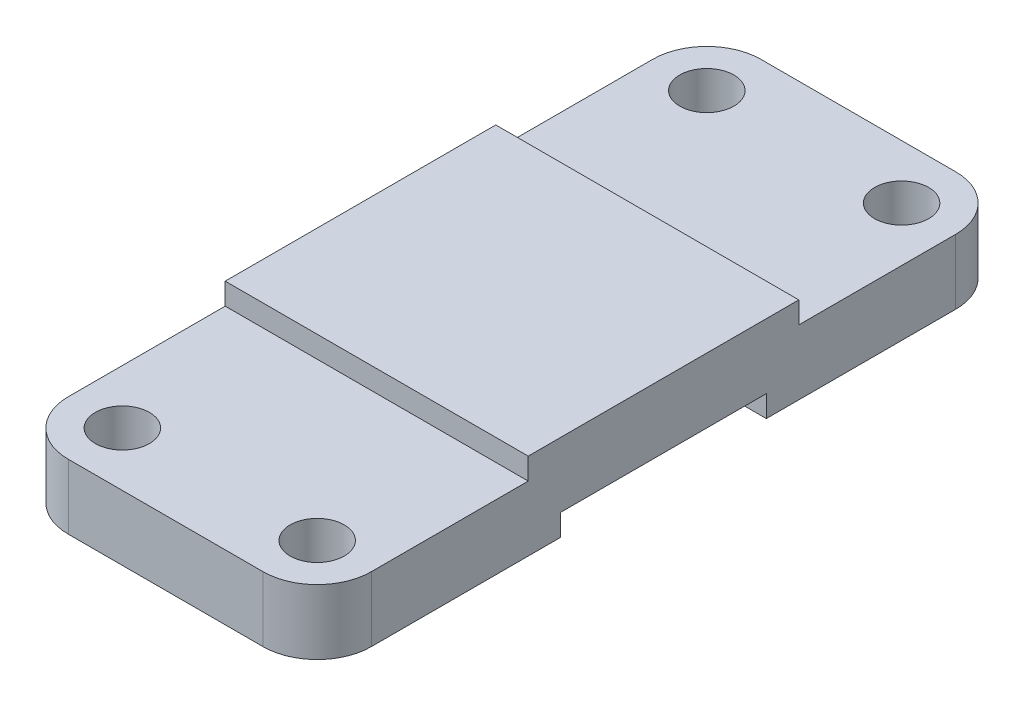
ISO-10303-21;
HEADER;
FILE_DESCRIPTION(('STEP AP214'),'2;1');
FILE_NAME('part.step','',(''),(''),'','','');
FILE_SCHEMA(('AUTOMOTIVE_DESIGN { 1 0 10303 214 1 1 1 1 }'));
ENDSEC;
DATA;
#1=APPLICATION_CONTEXT('core data for automotive mechanical design processes');
#2=APPLICATION_PROTOCOL_DEFINITION('international standard','automotive_design',2000,#1);
#3=PRODUCT_CONTEXT('',#1,'mechanical');
#4=PRODUCT('Part','Part','',(#3));
#5=PRODUCT_RELATED_PRODUCT_CATEGORY('part','',(#4));
#6=PRODUCT_DEFINITION_FORMATION('','',#4);
#7=PRODUCT_DEFINITION_CONTEXT('part definition',#1,'design');
#8=PRODUCT_DEFINITION('design','',#6,#7);
#9=PRODUCT_DEFINITION_SHAPE('','',#8);
#10=(LENGTH_UNIT() NAMED_UNIT(*) SI_UNIT(.MILLI.,.METRE.));
#11=(NAMED_UNIT(*) PLANE_ANGLE_UNIT() SI_UNIT($,.RADIAN.));
#12=(NAMED_UNIT(*) SI_UNIT($,.STERADIAN.) SOLID_ANGLE_UNIT());
#13=UNCERTAINTY_MEASURE_WITH_UNIT(LENGTH_MEASURE(1.E-05),#10,'distance_accuracy_value','');
#14=(GEOMETRIC_REPRESENTATION_CONTEXT(3) GLOBAL_UNCERTAINTY_ASSIGNED_CONTEXT((#13)) GLOBAL_UNIT_ASSIGNED_CONTEXT((#10,
#11,#12)) REPRESENTATION_CONTEXT('',''));
#15=CARTESIAN_POINT('',(0.,0.,0.));
#16=DIRECTION('',(0.,0.,1.));
#17=DIRECTION('',(1.,0.,0.));
#18=AXIS2_PLACEMENT_3D('',#15,#16,#17);
#19=CARTESIAN_POINT('',(-56.,0.,0.));
#20=DIRECTION('',(0.,0.,1.));
#21=DIRECTION('',(1.,0.,0.));
#22=AXIS2_PLACEMENT_3D('',#19,#20,#21);
#23=PLANE('',#22);
#24=DIRECTION('',(1.,0.,0.));
#25=VECTOR('',#24,1.);
#26=CARTESIAN_POINT('',(-56.,12.,0.));
#27=LINE('',#26,#25);
#28=CARTESIAN_POINT('',(-46.,12.,0.));
#29=VERTEX_POINT('',#28);
#30=CARTESIAN_POINT('',(-10.,12.,0.));
#31=VERTEX_POINT('',#30);
#32=EDGE_CURVE('E254',#29,#31,#27,.T.);
#33=ORIENTED_EDGE('',*,*,#32,.F.);
#34=DIRECTION('',(0.,-1.,0.));
#35=VECTOR('',#34,1.);
#36=CARTESIAN_POINT('',(-46.,0.,0.));
#37=LINE('',#36,#35);
#38=CARTESIAN_POINT('',(-46.,0.,0.));
#39=VERTEX_POINT('',#38);
#40=EDGE_CURVE('E325',#29,#39,#37,.T.);
#41=ORIENTED_EDGE('',*,*,#40,.T.);
#42=DIRECTION('',(1.,0.,0.));
#43=VECTOR('',#42,1.);
#44=CARTESIAN_POINT('',(-56.,0.,0.));
#45=LINE('',#44,#43);
#46=CARTESIAN_POINT('',(-10.,0.,0.));
#47=VERTEX_POINT('',#46);
#48=EDGE_CURVE('E177',#39,#47,#45,.T.);
#49=ORIENTED_EDGE('',*,*,#48,.T.);
#50=DIRECTION('',(0.,-1.,0.));
#51=VECTOR('',#50,1.);
#52=CARTESIAN_POINT('',(-10.,12.,0.));
#53=LINE('',#52,#51);
#54=EDGE_CURVE('E322',#47,#31,#53,.F.);
#55=ORIENTED_EDGE('',*,*,#54,.T.);
#56=EDGE_LOOP('',(#33,#41,#49,#55));
#57=FACE_BOUND('',#56,.T.);
#58=ADVANCED_FACE('F45',(#57),#23,.T.);
#59=CARTESIAN_POINT('',(-56.,12.,0.));
#60=DIRECTION('',(0.,1.,0.));
#61=DIRECTION('',(0.,0.,1.));
#62=AXIS2_PLACEMENT_3D('',#59,#60,#61);
#63=PLANE('',#62);
#64=CARTESIAN_POINT('',(-46.,12.,-10.));
#65=DIRECTION('',(0.,1.,0.));
#66=DIRECTION('',(0.,0.,1.));
#67=AXIS2_PLACEMENT_3D('',#64,#65,#66);
#68=CIRCLE('',#67,5.);
#69=CARTESIAN_POINT('',(-46.,12.,-5.));
#70=VERTEX_POINT('',#69);
#71=EDGE_CURVE('E468',#70,#70,#68,.T.);
#72=ORIENTED_EDGE('',*,*,#71,.F.);
#73=EDGE_LOOP('',(#72));
#74=FACE_BOUND('',#73,.T.);
#75=CARTESIAN_POINT('',(-10.,12.,-9.99999999999999));
#76=DIRECTION('',(0.,1.,0.));
#77=DIRECTION('',(0.,0.,1.));
#78=AXIS2_PLACEMENT_3D('',#75,#76,#77);
#79=CIRCLE('',#78,5.);
#80=CARTESIAN_POINT('',(-10.,12.,-5.));
#81=VERTEX_POINT('',#80);
#82=EDGE_CURVE('E476',#81,#81,#79,.T.);
#83=ORIENTED_EDGE('',*,*,#82,.F.);
#84=EDGE_LOOP('',(#83));
#85=FACE_BOUND('',#84,.T.);
#86=DIRECTION('',(0.,0.,1.));
#87=VECTOR('',#86,1.);
#88=CARTESIAN_POINT('',(-56.,12.,0.));
#89=LINE('',#88,#87);
#90=CARTESIAN_POINT('',(-56.,12.,-39.));
#91=VERTEX_POINT('',#90);
#92=CARTESIAN_POINT('',(-56.,12.,-10.));
#93=VERTEX_POINT('',#92);
#94=EDGE_CURVE('E214',#91,#93,#89,.T.);
#95=ORIENTED_EDGE('',*,*,#94,.T.);
#96=CARTESIAN_POINT('',(-46.,12.,-10.));
#97=DIRECTION('',(0.,1.,0.));
#98=DIRECTION('',(0.,0.,1.));
#99=AXIS2_PLACEMENT_3D('',#96,#97,#98);
#100=CIRCLE('',#99,10.);
#101=EDGE_CURVE('E11',#93,#29,#100,.T.);
#102=ORIENTED_EDGE('',*,*,#101,.T.);
#103=ORIENTED_EDGE('',*,*,#32,.T.);
#104=CARTESIAN_POINT('',(-10.,12.,-10.));
#105=DIRECTION('',(0.,1.,0.));
#106=DIRECTION('',(0.,0.,1.));
#107=AXIS2_PLACEMENT_3D('',#104,#105,#106);
#108=CIRCLE('',#107,10.);
#109=CARTESIAN_POINT('',(0.,12.,-10.));
#110=VERTEX_POINT('',#109);
#111=EDGE_CURVE('E54',#31,#110,#108,.T.);
#112=ORIENTED_EDGE('',*,*,#111,.T.);
#113=DIRECTION('',(0.,0.,1.));
#114=VECTOR('',#113,1.);
#115=CARTESIAN_POINT('',(0.,12.,0.));
#116=LINE('',#115,#114);
#117=CARTESIAN_POINT('',(0.,12.,-39.));
#118=VERTEX_POINT('',#117);
#119=EDGE_CURVE('E168',#118,#110,#116,.T.);
#120=ORIENTED_EDGE('',*,*,#119,.F.);
#121=DIRECTION('',(1.,0.,0.));
#122=VECTOR('',#121,1.);
#123=CARTESIAN_POINT('',(-56.,12.,-39.));
#124=LINE('',#123,#122);
#125=EDGE_CURVE('E259',#91,#118,#124,.T.);
#126=ORIENTED_EDGE('',*,*,#125,.F.);
#127=EDGE_LOOP('',(#95,#102,#103,#112,#120,#126));
#128=FACE_BOUND('',#127,.T.);
#129=ADVANCED_FACE('F335',(#74,#85,#128),#63,.T.);
#130=CARTESIAN_POINT('',(-56.,12.,-39.));
#131=DIRECTION('',(0.,0.,1.));
#132=DIRECTION('',(1.,0.,0.));
#133=AXIS2_PLACEMENT_3D('',#130,#131,#132);
#134=PLANE('',#133);
#135=DIRECTION('',(0.,-1.,0.));
#136=VECTOR('',#135,1.);
#137=CARTESIAN_POINT('',(0.,12.,-39.));
#138=LINE('',#137,#136);
#139=CARTESIAN_POINT('',(0.,16.,-39.));
#140=VERTEX_POINT('',#139);
#141=EDGE_CURVE('E247',#140,#118,#138,.T.);
#142=ORIENTED_EDGE('',*,*,#141,.F.);
#143=DIRECTION('',(1.,0.,0.));
#144=VECTOR('',#143,1.);
#145=CARTESIAN_POINT('',(-56.,16.,-39.));
#146=LINE('',#145,#144);
#147=CARTESIAN_POINT('',(-56.,16.,-39.));
#148=VERTEX_POINT('',#147);
#149=EDGE_CURVE('E262',#148,#140,#146,.T.);
#150=ORIENTED_EDGE('',*,*,#149,.F.);
#151=DIRECTION('',(0.,-1.,0.));
#152=VECTOR('',#151,1.);
#153=CARTESIAN_POINT('',(-56.,12.,-39.));
#154=LINE('',#153,#152);
#155=EDGE_CURVE('E210',#148,#91,#154,.T.);
#156=ORIENTED_EDGE('',*,*,#155,.T.);
#157=ORIENTED_EDGE('',*,*,#125,.T.);
#158=EDGE_LOOP('',(#142,#150,#156,#157));
#159=FACE_BOUND('',#158,.T.);
#160=ADVANCED_FACE('F398',(#159),#134,.T.);
#161=CARTESIAN_POINT('',(-56.,16.,-39.));
#162=DIRECTION('',(0.,1.,0.));
#163=DIRECTION('',(0.,0.,1.));
#164=AXIS2_PLACEMENT_3D('',#161,#162,#163);
#165=PLANE('',#164);
#166=DIRECTION('',(0.,0.,1.));
#167=VECTOR('',#166,1.);
#168=CARTESIAN_POINT('',(0.,16.,-39.));
#169=LINE('',#168,#167);
#170=CARTESIAN_POINT('',(0.,16.,-89.));
#171=VERTEX_POINT('',#170);
#172=EDGE_CURVE('E243',#171,#140,#169,.T.);
#173=ORIENTED_EDGE('',*,*,#172,.F.);
#174=DIRECTION('',(1.,0.,0.));
#175=VECTOR('',#174,1.);
#176=CARTESIAN_POINT('',(-56.,16.,-89.));
#177=LINE('',#176,#175);
#178=CARTESIAN_POINT('',(-56.,16.,-89.));
#179=VERTEX_POINT('',#178);
#180=EDGE_CURVE('E265',#179,#171,#177,.T.);
#181=ORIENTED_EDGE('',*,*,#180,.F.);
#182=DIRECTION('',(0.,0.,1.));
#183=VECTOR('',#182,1.);
#184=CARTESIAN_POINT('',(-56.,16.,-39.));
#185=LINE('',#184,#183);
#186=EDGE_CURVE('E206',#179,#148,#185,.T.);
#187=ORIENTED_EDGE('',*,*,#186,.T.);
#188=ORIENTED_EDGE('',*,*,#149,.T.);
#189=EDGE_LOOP('',(#173,#181,#187,#188));
#190=FACE_BOUND('',#189,.T.);
#191=ADVANCED_FACE('F353',(#190),#165,.T.);
#192=CARTESIAN_POINT('',(-56.,12.,-89.));
#193=DIRECTION('',(0.,0.,-1.));
#194=DIRECTION('',(-1.,0.,0.));
#195=AXIS2_PLACEMENT_3D('',#192,#193,#194);
#196=PLANE('',#195);
#197=DIRECTION('',(0.,1.,0.));
#198=VECTOR('',#197,1.);
#199=CARTESIAN_POINT('',(0.,12.,-89.));
#200=LINE('',#199,#198);
#201=CARTESIAN_POINT('',(0.,12.,-89.));
#202=VERTEX_POINT('',#201);
#203=EDGE_CURVE('E239',#202,#171,#200,.T.);
#204=ORIENTED_EDGE('',*,*,#203,.F.);
#205=DIRECTION('',(1.,0.,0.));
#206=VECTOR('',#205,1.);
#207=CARTESIAN_POINT('',(-56.,12.,-89.));
#208=LINE('',#207,#206);
#209=CARTESIAN_POINT('',(-56.,12.,-89.));
#210=VERTEX_POINT('',#209);
#211=EDGE_CURVE('E268',#210,#202,#208,.T.);
#212=ORIENTED_EDGE('',*,*,#211,.F.);
#213=DIRECTION('',(0.,1.,0.));
#214=VECTOR('',#213,1.);
#215=CARTESIAN_POINT('',(-56.,12.,-89.));
#216=LINE('',#215,#214);
#217=EDGE_CURVE('E202',#210,#179,#216,.T.);
#218=ORIENTED_EDGE('',*,*,#217,.T.);
#219=ORIENTED_EDGE('',*,*,#180,.T.);
#220=EDGE_LOOP('',(#204,#212,#218,#219));
#221=FACE_BOUND('',#220,.T.);
#222=ADVANCED_FACE('F356',(#221),#196,.T.);
#223=CARTESIAN_POINT('',(-56.,12.,-89.));
#224=DIRECTION('',(0.,1.,0.));
#225=DIRECTION('',(0.,0.,1.));
#226=AXIS2_PLACEMENT_3D('',#223,#224,#225);
#227=PLANE('',#226);
#228=CARTESIAN_POINT('',(-10.,12.,-118.));
#229=DIRECTION('',(0.,1.,0.));
#230=DIRECTION('',(0.,0.,1.));
#231=AXIS2_PLACEMENT_3D('',#228,#229,#230);
#232=CIRCLE('',#231,5.);
#233=CARTESIAN_POINT('',(-10.,12.,-113.));
#234=VERTEX_POINT('',#233);
#235=EDGE_CURVE('E462',#234,#234,#232,.T.);
#236=ORIENTED_EDGE('',*,*,#235,.F.);
#237=EDGE_LOOP('',(#236));
#238=FACE_BOUND('',#237,.T.);
#239=CARTESIAN_POINT('',(-46.,12.,-118.));
#240=DIRECTION('',(0.,1.,0.));
#241=DIRECTION('',(0.,0.,1.));
#242=AXIS2_PLACEMENT_3D('',#239,#240,#241);
#243=CIRCLE('',#242,5.);
#244=CARTESIAN_POINT('',(-46.,12.,-113.));
#245=VERTEX_POINT('',#244);
#246=EDGE_CURVE('E458',#245,#245,#243,.T.);
#247=ORIENTED_EDGE('',*,*,#246,.F.);
#248=EDGE_LOOP('',(#247));
#249=FACE_BOUND('',#248,.T.);
#250=DIRECTION('',(1.,0.,0.));
#251=VECTOR('',#250,1.);
#252=CARTESIAN_POINT('',(-56.,12.,-128.));
#253=LINE('',#252,#251);
#254=CARTESIAN_POINT('',(-46.,12.,-128.));
#255=VERTEX_POINT('',#254);
#256=CARTESIAN_POINT('',(-10.,12.,-128.));
#257=VERTEX_POINT('',#256);
#258=EDGE_CURVE('E272',#255,#257,#253,.T.);
#259=ORIENTED_EDGE('',*,*,#258,.F.);
#260=CARTESIAN_POINT('',(-46.,12.,-118.));
#261=DIRECTION('',(0.,1.,0.));
#262=DIRECTION('',(0.,0.,1.));
#263=AXIS2_PLACEMENT_3D('',#260,#261,#262);
#264=CIRCLE('',#263,10.);
#265=CARTESIAN_POINT('',(-56.,12.,-118.));
#266=VERTEX_POINT('',#265);
#267=EDGE_CURVE('E299',#255,#266,#264,.T.);
#268=ORIENTED_EDGE('',*,*,#267,.T.);
#269=DIRECTION('',(0.,0.,1.));
#270=VECTOR('',#269,1.);
#271=CARTESIAN_POINT('',(-56.,12.,-89.));
#272=LINE('',#271,#270);
#273=EDGE_CURVE('E199',#266,#210,#272,.T.);
#274=ORIENTED_EDGE('',*,*,#273,.T.);
#275=ORIENTED_EDGE('',*,*,#211,.T.);
#276=DIRECTION('',(0.,0.,1.));
#277=VECTOR('',#276,1.);
#278=CARTESIAN_POINT('',(0.,12.,-89.));
#279=LINE('',#278,#277);
#280=CARTESIAN_POINT('',(0.,12.,-118.));
#281=VERTEX_POINT('',#280);
#282=EDGE_CURVE('E236',#281,#202,#279,.T.);
#283=ORIENTED_EDGE('',*,*,#282,.F.);
#284=CARTESIAN_POINT('',(-10.,12.,-118.));
#285=DIRECTION('',(0.,1.,0.));
#286=DIRECTION('',(0.,0.,1.));
#287=AXIS2_PLACEMENT_3D('',#284,#285,#286);
#288=CIRCLE('',#287,10.);
#289=EDGE_CURVE('E296',#281,#257,#288,.T.);
#290=ORIENTED_EDGE('',*,*,#289,.T.);
#291=EDGE_LOOP('',(#259,#268,#274,#275,#283,#290));
#292=FACE_BOUND('',#291,.T.);
#293=ADVANCED_FACE('F442',(#238,#249,#292),#227,.T.);
#294=CARTESIAN_POINT('',(-56.,0.,-128.));
#295=DIRECTION('',(0.,0.,-1.));
#296=DIRECTION('',(-1.,0.,0.));
#297=AXIS2_PLACEMENT_3D('',#294,#295,#296);
#298=PLANE('',#297);
#299=DIRECTION('',(1.,0.,0.));
#300=VECTOR('',#299,1.);
#301=CARTESIAN_POINT('',(-56.,0.,-128.));
#302=LINE('',#301,#300);
#303=CARTESIAN_POINT('',(-46.,0.,-128.));
#304=VERTEX_POINT('',#303);
#305=CARTESIAN_POINT('',(-10.,0.,-128.));
#306=VERTEX_POINT('',#305);
#307=EDGE_CURVE('E276',#304,#306,#302,.T.);
#308=ORIENTED_EDGE('',*,*,#307,.F.);
#309=DIRECTION('',(0.,1.,0.));
#310=VECTOR('',#309,1.);
#311=CARTESIAN_POINT('',(-46.,0.,-128.));
#312=LINE('',#311,#310);
#313=EDGE_CURVE('E292',#304,#255,#312,.T.);
#314=ORIENTED_EDGE('',*,*,#313,.T.);
#315=ORIENTED_EDGE('',*,*,#258,.T.);
#316=DIRECTION('',(0.,1.,0.));
#317=VECTOR('',#316,1.);
#318=CARTESIAN_POINT('',(-10.,0.,-128.));
#319=LINE('',#318,#317);
#320=EDGE_CURVE('E258',#257,#306,#319,.F.);
#321=ORIENTED_EDGE('',*,*,#320,.T.);
#322=EDGE_LOOP('',(#308,#314,#315,#321));
#323=FACE_BOUND('',#322,.T.);
#324=ADVANCED_FACE('F370',(#323),#298,.T.);
#325=CARTESIAN_POINT('',(-56.,0.,-83.));
#326=DIRECTION('',(0.,-1.,0.));
#327=DIRECTION('',(0.,0.,-1.));
#328=AXIS2_PLACEMENT_3D('',#325,#326,#327);
#329=PLANE('',#328);
#330=CARTESIAN_POINT('',(-10.,0.,-118.));
#331=DIRECTION('',(0.,1.,0.));
#332=DIRECTION('',(0.,0.,1.));
#333=AXIS2_PLACEMENT_3D('',#330,#331,#332);
#334=CIRCLE('',#333,5.);
#335=CARTESIAN_POINT('',(-10.,0.,-113.));
#336=VERTEX_POINT('',#335);
#337=EDGE_CURVE('E454',#336,#336,#334,.T.);
#338=ORIENTED_EDGE('',*,*,#337,.T.);
#339=EDGE_LOOP('',(#338));
#340=FACE_BOUND('',#339,.T.);
#341=CARTESIAN_POINT('',(-46.,0.,-118.));
#342=DIRECTION('',(0.,1.,0.));
#343=DIRECTION('',(0.,0.,1.));
#344=AXIS2_PLACEMENT_3D('',#341,#342,#343);
#345=CIRCLE('',#344,5.);
#346=CARTESIAN_POINT('',(-46.,0.,-113.));
#347=VERTEX_POINT('',#346);
#348=EDGE_CURVE('E221',#347,#347,#345,.T.);
#349=ORIENTED_EDGE('',*,*,#348,.T.);
#350=EDGE_LOOP('',(#349));
#351=FACE_BOUND('',#350,.T.);
#352=DIRECTION('',(0.,0.,-1.));
#353=VECTOR('',#352,1.);
#354=CARTESIAN_POINT('',(-56.,0.,-83.));
#355=LINE('',#354,#353);
#356=CARTESIAN_POINT('',(-56.,0.,-83.));
#357=VERTEX_POINT('',#356);
#358=CARTESIAN_POINT('',(-56.,0.,-118.));
#359=VERTEX_POINT('',#358);
#360=EDGE_CURVE('E195',#357,#359,#355,.T.);
#361=ORIENTED_EDGE('',*,*,#360,.T.);
#362=CARTESIAN_POINT('',(-46.,0.,-118.));
#363=DIRECTION('',(0.,-1.,0.));
#364=DIRECTION('',(0.,0.,-1.));
#365=AXIS2_PLACEMENT_3D('',#362,#363,#364);
#366=CIRCLE('',#365,10.);
#367=EDGE_CURVE('E311',#359,#304,#366,.T.);
#368=ORIENTED_EDGE('',*,*,#367,.T.);
#369=ORIENTED_EDGE('',*,*,#307,.T.);
#370=CARTESIAN_POINT('',(-10.,0.,-118.));
#371=DIRECTION('',(0.,-1.,0.));
#372=DIRECTION('',(0.,0.,-1.));
#373=AXIS2_PLACEMENT_3D('',#370,#371,#372);
#374=CIRCLE('',#373,10.);
#375=CARTESIAN_POINT('',(0.,0.,-118.));
#376=VERTEX_POINT('',#375);
#377=EDGE_CURVE('E308',#306,#376,#374,.T.);
#378=ORIENTED_EDGE('',*,*,#377,.T.);
#379=DIRECTION('',(0.,0.,-1.));
#380=VECTOR('',#379,1.);
#381=CARTESIAN_POINT('',(0.,0.,-83.));
#382=LINE('',#381,#380);
#383=CARTESIAN_POINT('',(0.,0.,-83.));
#384=VERTEX_POINT('',#383);
#385=EDGE_CURVE('E232',#384,#376,#382,.T.);
#386=ORIENTED_EDGE('',*,*,#385,.F.);
#387=DIRECTION('',(1.,0.,0.));
#388=VECTOR('',#387,1.);
#389=CARTESIAN_POINT('',(-56.,0.,-83.));
#390=LINE('',#389,#388);
#391=EDGE_CURVE('E280',#357,#384,#390,.T.);
#392=ORIENTED_EDGE('',*,*,#391,.F.);
#393=EDGE_LOOP('',(#361,#368,#369,#378,#386,#392));
#394=FACE_BOUND('',#393,.T.);
#395=ADVANCED_FACE('F367',(#340,#351,#394),#329,.T.);
#396=CARTESIAN_POINT('',(-56.,0.,-83.));
#397=DIRECTION('',(0.,0.,1.));
#398=DIRECTION('',(1.,0.,0.));
#399=AXIS2_PLACEMENT_3D('',#396,#397,#398);
#400=PLANE('',#399);
#401=DIRECTION('',(0.,-1.,0.));
#402=VECTOR('',#401,1.);
#403=CARTESIAN_POINT('',(0.,0.,-83.));
#404=LINE('',#403,#402);
#405=CARTESIAN_POINT('',(0.,4.,-83.));
#406=VERTEX_POINT('',#405);
#407=EDGE_CURVE('E228',#406,#384,#404,.T.);
#408=ORIENTED_EDGE('',*,*,#407,.F.);
#409=DIRECTION('',(1.,0.,0.));
#410=VECTOR('',#409,1.);
#411=CARTESIAN_POINT('',(-56.,4.,-83.));
#412=LINE('',#411,#410);
#413=CARTESIAN_POINT('',(-56.,4.,-83.));
#414=VERTEX_POINT('',#413);
#415=EDGE_CURVE('E283',#414,#406,#412,.T.);
#416=ORIENTED_EDGE('',*,*,#415,.F.);
#417=DIRECTION('',(0.,-1.,0.));
#418=VECTOR('',#417,1.);
#419=CARTESIAN_POINT('',(-56.,0.,-83.));
#420=LINE('',#419,#418);
#421=EDGE_CURVE('E188',#414,#357,#420,.T.);
#422=ORIENTED_EDGE('',*,*,#421,.T.);
#423=ORIENTED_EDGE('',*,*,#391,.T.);
#424=EDGE_LOOP('',(#408,#416,#422,#423));
#425=FACE_BOUND('',#424,.T.);
#426=ADVANCED_FACE('F381',(#425),#400,.T.);
#427=CARTESIAN_POINT('',(-56.,4.00000000000001,-45.));
#428=DIRECTION('',(0.,-1.,0.));
#429=DIRECTION('',(0.,0.,-1.));
#430=AXIS2_PLACEMENT_3D('',#427,#428,#429);
#431=PLANE('',#430);
#432=DIRECTION('',(0.,0.,-1.));
#433=VECTOR('',#432,1.);
#434=CARTESIAN_POINT('',(0.,4.00000000000001,-45.));
#435=LINE('',#434,#433);
#436=CARTESIAN_POINT('',(0.,4.00000000000001,-45.));
#437=VERTEX_POINT('',#436);
#438=EDGE_CURVE('E224',#437,#406,#435,.T.);
#439=ORIENTED_EDGE('',*,*,#438,.F.);
#440=DIRECTION('',(1.,0.,0.));
#441=VECTOR('',#440,1.);
#442=CARTESIAN_POINT('',(-56.,4.00000000000001,-45.));
#443=LINE('',#442,#441);
#444=CARTESIAN_POINT('',(-56.,4.00000000000001,-45.));
#445=VERTEX_POINT('',#444);
#446=EDGE_CURVE('E176',#445,#437,#443,.T.);
#447=ORIENTED_EDGE('',*,*,#446,.F.);
#448=DIRECTION('',(0.,0.,-1.));
#449=VECTOR('',#448,1.);
#450=CARTESIAN_POINT('',(-56.,4.00000000000001,-45.));
#451=LINE('',#450,#449);
#452=EDGE_CURVE('E184',#445,#414,#451,.T.);
#453=ORIENTED_EDGE('',*,*,#452,.T.);
#454=ORIENTED_EDGE('',*,*,#415,.T.);
#455=EDGE_LOOP('',(#439,#447,#453,#454));
#456=FACE_BOUND('',#455,.T.);
#457=ADVANCED_FACE('F383',(#456),#431,.T.);
#458=CARTESIAN_POINT('',(-56.,0.,-45.));
#459=DIRECTION('',(0.,0.,-1.));
#460=DIRECTION('',(-1.,0.,0.));
#461=AXIS2_PLACEMENT_3D('',#458,#459,#460);
#462=PLANE('',#461);
#463=DIRECTION('',(0.,1.,0.));
#464=VECTOR('',#463,1.);
#465=CARTESIAN_POINT('',(0.,0.,-45.));
#466=LINE('',#465,#464);
#467=CARTESIAN_POINT('',(0.,0.,-45.));
#468=VERTEX_POINT('',#467);
#469=EDGE_CURVE('E174',#468,#437,#466,.T.);
#470=ORIENTED_EDGE('',*,*,#469,.F.);
#471=DIRECTION('',(1.,0.,0.));
#472=VECTOR('',#471,1.);
#473=CARTESIAN_POINT('',(-56.,0.,-45.));
#474=LINE('',#473,#472);
#475=CARTESIAN_POINT('',(-56.,0.,-45.));
#476=VERTEX_POINT('',#475);
#477=EDGE_CURVE('E162',#476,#468,#474,.T.);
#478=ORIENTED_EDGE('',*,*,#477,.F.);
#479=DIRECTION('',(0.,1.,0.));
#480=VECTOR('',#479,1.);
#481=CARTESIAN_POINT('',(-56.,0.,-45.));
#482=LINE('',#481,#480);
#483=EDGE_CURVE('E167',#476,#445,#482,.T.);
#484=ORIENTED_EDGE('',*,*,#483,.T.);
#485=ORIENTED_EDGE('',*,*,#446,.T.);
#486=EDGE_LOOP('',(#470,#478,#484,#485));
#487=FACE_BOUND('',#486,.T.);
#488=ADVANCED_FACE('F172',(#487),#462,.T.);
#489=CARTESIAN_POINT('',(-56.,0.,0.));
#490=DIRECTION('',(0.,-1.,0.));
#491=DIRECTION('',(0.,0.,-1.));
#492=AXIS2_PLACEMENT_3D('',#489,#490,#491);
#493=PLANE('',#492);
#494=CARTESIAN_POINT('',(-46.,0.,-10.));
#495=DIRECTION('',(0.,1.,0.));
#496=DIRECTION('',(0.,0.,1.));
#497=AXIS2_PLACEMENT_3D('',#494,#495,#496);
#498=CIRCLE('',#497,5.);
#499=CARTESIAN_POINT('',(-46.,0.,-5.));
#500=VERTEX_POINT('',#499);
#501=EDGE_CURVE('E464',#500,#500,#498,.T.);
#502=ORIENTED_EDGE('',*,*,#501,.T.);
#503=EDGE_LOOP('',(#502));
#504=FACE_BOUND('',#503,.T.);
#505=CARTESIAN_POINT('',(-10.,0.,-9.99999999999999));
#506=DIRECTION('',(0.,1.,0.));
#507=DIRECTION('',(0.,0.,1.));
#508=AXIS2_PLACEMENT_3D('',#505,#506,#507);
#509=CIRCLE('',#508,5.);
#510=CARTESIAN_POINT('',(-10.,0.,-5.));
#511=VERTEX_POINT('',#510);
#512=EDGE_CURVE('E472',#511,#511,#509,.T.);
#513=ORIENTED_EDGE('',*,*,#512,.T.);
#514=EDGE_LOOP('',(#513));
#515=FACE_BOUND('',#514,.T.);
#516=ORIENTED_EDGE('',*,*,#48,.F.);
#517=CARTESIAN_POINT('',(-46.,0.,-10.));
#518=DIRECTION('',(0.,-1.,0.));
#519=DIRECTION('',(0.,0.,-1.));
#520=AXIS2_PLACEMENT_3D('',#517,#518,#519);
#521=CIRCLE('',#520,10.);
#522=CARTESIAN_POINT('',(-56.,0.,-10.));
#523=VERTEX_POINT('',#522);
#524=EDGE_CURVE('E69',#39,#523,#521,.T.);
#525=ORIENTED_EDGE('',*,*,#524,.T.);
#526=DIRECTION('',(0.,0.,-1.));
#527=VECTOR('',#526,1.);
#528=CARTESIAN_POINT('',(-56.,0.,0.));
#529=LINE('',#528,#527);
#530=EDGE_CURVE('E159',#523,#476,#529,.T.);
#531=ORIENTED_EDGE('',*,*,#530,.T.);
#532=ORIENTED_EDGE('',*,*,#477,.T.);
#533=DIRECTION('',(0.,0.,-1.));
#534=VECTOR('',#533,1.);
#535=CARTESIAN_POINT('',(0.,0.,0.));
#536=LINE('',#535,#534);
#537=CARTESIAN_POINT('',(0.,0.,-10.));
#538=VERTEX_POINT('',#537);
#539=EDGE_CURVE('E218',#538,#468,#536,.T.);
#540=ORIENTED_EDGE('',*,*,#539,.F.);
#541=CARTESIAN_POINT('',(-10.,0.,-10.));
#542=DIRECTION('',(0.,-1.,0.));
#543=DIRECTION('',(0.,0.,-1.));
#544=AXIS2_PLACEMENT_3D('',#541,#542,#543);
#545=CIRCLE('',#544,10.);
#546=EDGE_CURVE('E61',#538,#47,#545,.T.);
#547=ORIENTED_EDGE('',*,*,#546,.T.);
#548=EDGE_LOOP('',(#516,#525,#531,#532,#540,#547));
#549=FACE_BOUND('',#548,.T.);
#550=ADVANCED_FACE('F161',(#504,#515,#549),#493,.T.);
#551=CARTESIAN_POINT('',(-56.,0.,0.));
#552=DIRECTION('',(-1.,0.,0.));
#553=DIRECTION('',(0.,0.,1.));
#554=AXIS2_PLACEMENT_3D('',#551,#552,#553);
#555=PLANE('',#554);
#556=ORIENTED_EDGE('',*,*,#273,.F.);
#557=DIRECTION('',(0.,1.,0.));
#558=VECTOR('',#557,1.);
#559=CARTESIAN_POINT('',(-56.,0.,-118.));
#560=LINE('',#559,#558);
#561=EDGE_CURVE('E305',#266,#359,#560,.F.);
#562=ORIENTED_EDGE('',*,*,#561,.T.);
#563=ORIENTED_EDGE('',*,*,#360,.F.);
#564=ORIENTED_EDGE('',*,*,#421,.F.);
#565=ORIENTED_EDGE('',*,*,#452,.F.);
#566=ORIENTED_EDGE('',*,*,#483,.F.);
#567=ORIENTED_EDGE('',*,*,#530,.F.);
#568=DIRECTION('',(0.,-1.,0.));
#569=VECTOR('',#568,1.);
#570=CARTESIAN_POINT('',(-56.,0.,-10.));
#571=LINE('',#570,#569);
#572=EDGE_CURVE('E302',#523,#93,#571,.F.);
#573=ORIENTED_EDGE('',*,*,#572,.T.);
#574=ORIENTED_EDGE('',*,*,#94,.F.);
#575=ORIENTED_EDGE('',*,*,#155,.F.);
#576=ORIENTED_EDGE('',*,*,#186,.F.);
#577=ORIENTED_EDGE('',*,*,#217,.F.);
#578=EDGE_LOOP('',(#556,#562,#563,#564,#565,#566,#567,#573,#574,#575,#576,#577));
#579=FACE_BOUND('',#578,.T.);
#580=ADVANCED_FACE('F181',(#579),#555,.T.);
#581=CARTESIAN_POINT('',(0.,0.,0.));
#582=DIRECTION('',(-1.,0.,0.));
#583=DIRECTION('',(0.,0.,1.));
#584=AXIS2_PLACEMENT_3D('',#581,#582,#583);
#585=PLANE('',#584);
#586=ORIENTED_EDGE('',*,*,#385,.T.);
#587=DIRECTION('',(0.,1.,0.));
#588=VECTOR('',#587,1.);
#589=CARTESIAN_POINT('',(0.,12.,-118.));
#590=LINE('',#589,#588);
#591=EDGE_CURVE('E318',#376,#281,#590,.T.);
#592=ORIENTED_EDGE('',*,*,#591,.T.);
#593=ORIENTED_EDGE('',*,*,#282,.T.);
#594=ORIENTED_EDGE('',*,*,#203,.T.);
#595=ORIENTED_EDGE('',*,*,#172,.T.);
#596=ORIENTED_EDGE('',*,*,#141,.T.);
#597=ORIENTED_EDGE('',*,*,#119,.T.);
#598=DIRECTION('',(0.,-1.,0.));
#599=VECTOR('',#598,1.);
#600=CARTESIAN_POINT('',(0.,0.,-10.));
#601=LINE('',#600,#599);
#602=EDGE_CURVE('E314',#110,#538,#601,.T.);
#603=ORIENTED_EDGE('',*,*,#602,.T.);
#604=ORIENTED_EDGE('',*,*,#539,.T.);
#605=ORIENTED_EDGE('',*,*,#469,.T.);
#606=ORIENTED_EDGE('',*,*,#438,.T.);
#607=ORIENTED_EDGE('',*,*,#407,.T.);
#608=EDGE_LOOP('',(#586,#592,#593,#594,#595,#596,#597,#603,#604,#605,#606,#607));
#609=FACE_BOUND('',#608,.T.);
#610=ADVANCED_FACE('F341',(#609),#585,.F.);
#611=CARTESIAN_POINT('',(-46.,0.,-118.));
#612=DIRECTION('',(0.,1.,0.));
#613=DIRECTION('',(0.,0.,1.));
#614=AXIS2_PLACEMENT_3D('',#611,#612,#613);
#615=CYLINDRICAL_SURFACE('',#614,10.);
#616=ORIENTED_EDGE('',*,*,#367,.F.);
#617=ORIENTED_EDGE('',*,*,#561,.F.);
#618=ORIENTED_EDGE('',*,*,#267,.F.);
#619=ORIENTED_EDGE('',*,*,#313,.F.);
#620=EDGE_LOOP('',(#616,#617,#618,#619));
#621=FACE_BOUND('',#620,.T.);
#622=ADVANCED_FACE('F363',(#621),#615,.T.);
#623=CARTESIAN_POINT('',(-10.,0.,-118.));
#624=DIRECTION('',(0.,-1.,0.));
#625=DIRECTION('',(0.,0.,-1.));
#626=AXIS2_PLACEMENT_3D('',#623,#624,#625);
#627=CYLINDRICAL_SURFACE('',#626,10.);
#628=ORIENTED_EDGE('',*,*,#377,.F.);
#629=ORIENTED_EDGE('',*,*,#320,.F.);
#630=ORIENTED_EDGE('',*,*,#289,.F.);
#631=ORIENTED_EDGE('',*,*,#591,.F.);
#632=EDGE_LOOP('',(#628,#629,#630,#631));
#633=FACE_BOUND('',#632,.T.);
#634=ADVANCED_FACE('F374',(#633),#627,.T.);
#635=CARTESIAN_POINT('',(-46.,0.,-10.));
#636=DIRECTION('',(0.,-1.,0.));
#637=DIRECTION('',(0.,0.,-1.));
#638=AXIS2_PLACEMENT_3D('',#635,#636,#637);
#639=CYLINDRICAL_SURFACE('',#638,10.);
#640=ORIENTED_EDGE('',*,*,#101,.F.);
#641=ORIENTED_EDGE('',*,*,#572,.F.);
#642=ORIENTED_EDGE('',*,*,#524,.F.);
#643=ORIENTED_EDGE('',*,*,#40,.F.);
#644=EDGE_LOOP('',(#640,#641,#642,#643));
#645=FACE_BOUND('',#644,.T.);
#646=ADVANCED_FACE('F345',(#645),#639,.T.);
#647=CARTESIAN_POINT('',(-10.,0.,-10.));
#648=DIRECTION('',(0.,1.,0.));
#649=DIRECTION('',(0.,0.,1.));
#650=AXIS2_PLACEMENT_3D('',#647,#648,#649);
#651=CYLINDRICAL_SURFACE('',#650,10.);
#652=ORIENTED_EDGE('',*,*,#111,.F.);
#653=ORIENTED_EDGE('',*,*,#54,.F.);
#654=ORIENTED_EDGE('',*,*,#546,.F.);
#655=ORIENTED_EDGE('',*,*,#602,.F.);
#656=EDGE_LOOP('',(#652,#653,#654,#655));
#657=FACE_BOUND('',#656,.T.);
#658=ADVANCED_FACE('F47',(#657),#651,.T.);
#659=CARTESIAN_POINT('',(-10.,0.,-9.99999999999999));
#660=DIRECTION('',(0.,1.,0.));
#661=DIRECTION('',(0.,0.,1.));
#662=AXIS2_PLACEMENT_3D('',#659,#660,#661);
#663=CYLINDRICAL_SURFACE('',#662,5.);
#664=ORIENTED_EDGE('',*,*,#512,.F.);
#665=EDGE_LOOP('',(#664));
#666=FACE_BOUND('',#665,.T.);
#667=ORIENTED_EDGE('',*,*,#82,.T.);
#668=EDGE_LOOP('',(#667));
#669=FACE_BOUND('',#668,.T.);
#670=ADVANCED_FACE('F410',(#666,#669),#663,.F.);
#671=CARTESIAN_POINT('',(-46.,0.,-10.));
#672=DIRECTION('',(0.,1.,0.));
#673=DIRECTION('',(0.,0.,1.));
#674=AXIS2_PLACEMENT_3D('',#671,#672,#673);
#675=CYLINDRICAL_SURFACE('',#674,5.);
#676=ORIENTED_EDGE('',*,*,#501,.F.);
#677=EDGE_LOOP('',(#676));
#678=FACE_BOUND('',#677,.T.);
#679=ORIENTED_EDGE('',*,*,#71,.T.);
#680=EDGE_LOOP('',(#679));
#681=FACE_BOUND('',#680,.T.);
#682=ADVANCED_FACE('F414',(#678,#681),#675,.F.);
#683=CARTESIAN_POINT('',(-46.,0.,-118.));
#684=DIRECTION('',(0.,1.,0.));
#685=DIRECTION('',(0.,0.,1.));
#686=AXIS2_PLACEMENT_3D('',#683,#684,#685);
#687=CYLINDRICAL_SURFACE('',#686,5.);
#688=ORIENTED_EDGE('',*,*,#348,.F.);
#689=EDGE_LOOP('',(#688));
#690=FACE_BOUND('',#689,.T.);
#691=ORIENTED_EDGE('',*,*,#246,.T.);
#692=EDGE_LOOP('',(#691));
#693=FACE_BOUND('',#692,.T.);
#694=ADVANCED_FACE('F421',(#690,#693),#687,.F.);
#695=CARTESIAN_POINT('',(-10.,0.,-118.));
#696=DIRECTION('',(0.,1.,0.));
#697=DIRECTION('',(0.,0.,1.));
#698=AXIS2_PLACEMENT_3D('',#695,#696,#697);
#699=CYLINDRICAL_SURFACE('',#698,5.);
#700=ORIENTED_EDGE('',*,*,#337,.F.);
#701=EDGE_LOOP('',(#700));
#702=FACE_BOUND('',#701,.T.);
#703=ORIENTED_EDGE('',*,*,#235,.T.);
#704=EDGE_LOOP('',(#703));
#705=FACE_BOUND('',#704,.T.);
#706=ADVANCED_FACE('F427',(#702,#705),#699,.F.);
#707=CLOSED_SHELL('',(#58,#129,#160,#191,#222,#293,#324,#395,#426,#457,#488,#550,#580,#610,#622,
#634,#646,#658,#670,#682,#694,#706));
#708=MANIFOLD_SOLID_BREP('B2',#707);
#709=ADVANCED_BREP_SHAPE_REPRESENTATION('',(#18,#708),#14);
#710=SHAPE_DEFINITION_REPRESENTATION(#9,#709);
ENDSEC;
END-ISO-10303-21;
